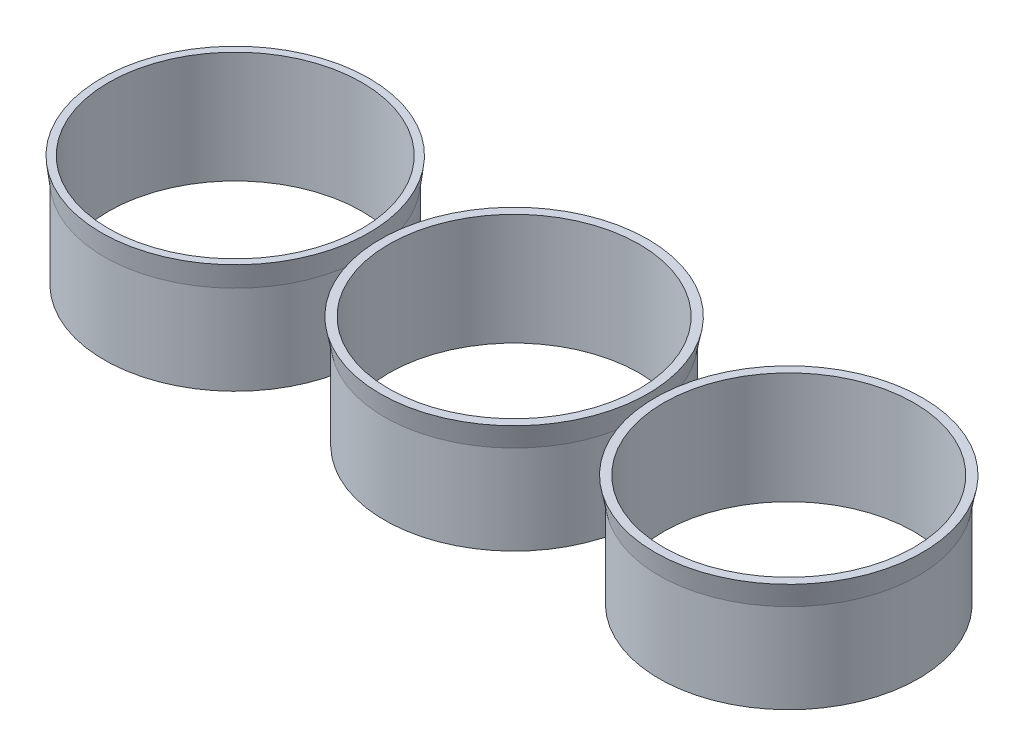
ISO-10303-21;
HEADER;
FILE_DESCRIPTION(('STEP AP214'),'2;1');
FILE_NAME('part.step','',(''),(''),'','','');
FILE_SCHEMA(('AUTOMOTIVE_DESIGN { 1 0 10303 214 1 1 1 1 }'));
ENDSEC;
DATA;
#1=APPLICATION_CONTEXT('core data for automotive mechanical design processes');
#2=APPLICATION_PROTOCOL_DEFINITION('international standard','automotive_design',2000,#1);
#3=PRODUCT_CONTEXT('',#1,'mechanical');
#4=PRODUCT('Part','Part','',(#3));
#5=PRODUCT_RELATED_PRODUCT_CATEGORY('part','',(#4));
#6=PRODUCT_DEFINITION_FORMATION('','',#4);
#7=PRODUCT_DEFINITION_CONTEXT('part definition',#1,'design');
#8=PRODUCT_DEFINITION('design','',#6,#7);
#9=PRODUCT_DEFINITION_SHAPE('','',#8);
#10=(LENGTH_UNIT() NAMED_UNIT(*) SI_UNIT(.MILLI.,.METRE.));
#11=(NAMED_UNIT(*) PLANE_ANGLE_UNIT() SI_UNIT($,.RADIAN.));
#12=(NAMED_UNIT(*) SI_UNIT($,.STERADIAN.) SOLID_ANGLE_UNIT());
#13=UNCERTAINTY_MEASURE_WITH_UNIT(LENGTH_MEASURE(1.E-05),#10,'distance_accuracy_value','');
#14=(GEOMETRIC_REPRESENTATION_CONTEXT(3) GLOBAL_UNCERTAINTY_ASSIGNED_CONTEXT((#13)) GLOBAL_UNIT_ASSIGNED_CONTEXT((#10,
#11,#12)) REPRESENTATION_CONTEXT('',''));
#15=CARTESIAN_POINT('',(0.,0.,0.));
#16=DIRECTION('',(0.,0.,1.));
#17=DIRECTION('',(1.,0.,0.));
#18=AXIS2_PLACEMENT_3D('',#15,#16,#17);
#19=CARTESIAN_POINT('',(121.7,0.,0.));
#20=DIRECTION('',(0.,-1.,0.));
#21=DIRECTION('',(0.,0.,-1.));
#22=AXIS2_PLACEMENT_3D('',#19,#20,#21);
#23=PLANE('',#22);
#24=CARTESIAN_POINT('',(99.25,0.,0.));
#25=DIRECTION('',(0.,-1.,0.));
#26=DIRECTION('',(0.,0.,-1.));
#27=AXIS2_PLACEMENT_3D('',#24,#25,#26);
#28=CIRCLE('',#27,23.25);
#29=CARTESIAN_POINT('',(99.25,0.,-23.25));
#30=VERTEX_POINT('',#29);
#31=EDGE_CURVE('E11',#30,#30,#28,.T.);
#32=ORIENTED_EDGE('',*,*,#31,.T.);
#33=EDGE_LOOP('',(#32));
#34=FACE_BOUND('',#33,.T.);
#35=CARTESIAN_POINT('',(99.25,0.,0.));
#36=DIRECTION('',(0.,-1.,0.));
#37=DIRECTION('',(0.,0.,-1.));
#38=AXIS2_PLACEMENT_3D('',#35,#36,#37);
#39=CIRCLE('',#38,22.45);
#40=CARTESIAN_POINT('',(99.25,0.,-22.45));
#41=VERTEX_POINT('',#40);
#42=EDGE_CURVE('E59',#41,#41,#39,.T.);
#43=ORIENTED_EDGE('',*,*,#42,.F.);
#44=EDGE_LOOP('',(#43));
#45=FACE_BOUND('',#44,.T.);
#46=ADVANCED_FACE('F40',(#34,#45),#23,.T.);
#47=CARTESIAN_POINT('',(99.25,0.,0.));
#48=DIRECTION('',(0.,-1.,0.));
#49=DIRECTION('',(0.,0.,-1.));
#50=AXIS2_PLACEMENT_3D('',#47,#48,#49);
#51=CYLINDRICAL_SURFACE('',#50,23.25);
#52=CARTESIAN_POINT('',(99.25,16.,0.));
#53=DIRECTION('',(0.,-1.,0.));
#54=DIRECTION('',(0.,0.,-1.));
#55=AXIS2_PLACEMENT_3D('',#52,#53,#54);
#56=CIRCLE('',#55,23.25);
#57=CARTESIAN_POINT('',(99.25,16.,-23.25));
#58=VERTEX_POINT('',#57);
#59=EDGE_CURVE('E46',#58,#58,#56,.T.);
#60=ORIENTED_EDGE('',*,*,#59,.T.);
#61=EDGE_LOOP('',(#60));
#62=FACE_BOUND('',#61,.T.);
#63=ORIENTED_EDGE('',*,*,#31,.F.);
#64=EDGE_LOOP('',(#63));
#65=FACE_BOUND('',#64,.T.);
#66=ADVANCED_FACE('F67',(#62,#65),#51,.T.);
#67=CARTESIAN_POINT('',(99.25,16.,0.));
#68=DIRECTION('',(0.,1.,0.));
#69=DIRECTION('',(0.,0.,1.));
#70=AXIS2_PLACEMENT_3D('',#67,#68,#69);
#71=CONICAL_SURFACE('',#70,23.25,0.185347949995695);
#72=CARTESIAN_POINT('',(99.25,20.,0.));
#73=DIRECTION('',(0.,-1.,0.));
#74=DIRECTION('',(0.,0.,-1.));
#75=AXIS2_PLACEMENT_3D('',#72,#73,#74);
#76=CIRCLE('',#75,24.);
#77=CARTESIAN_POINT('',(99.25,20.,-24.));
#78=VERTEX_POINT('',#77);
#79=EDGE_CURVE('E50',#78,#78,#76,.T.);
#80=ORIENTED_EDGE('',*,*,#79,.T.);
#81=EDGE_LOOP('',(#80));
#82=FACE_BOUND('',#81,.T.);
#83=ORIENTED_EDGE('',*,*,#59,.F.);
#84=EDGE_LOOP('',(#83));
#85=FACE_BOUND('',#84,.T.);
#86=ADVANCED_FACE('F71',(#82,#85),#71,.T.);
#87=CARTESIAN_POINT('',(123.25,20.,0.));
#88=DIRECTION('',(0.,1.,0.));
#89=DIRECTION('',(0.,0.,1.));
#90=AXIS2_PLACEMENT_3D('',#87,#88,#89);
#91=PLANE('',#90);
#92=CARTESIAN_POINT('',(99.25,20.,0.));
#93=DIRECTION('',(0.,-1.,0.));
#94=DIRECTION('',(0.,0.,-1.));
#95=AXIS2_PLACEMENT_3D('',#92,#93,#94);
#96=CIRCLE('',#95,22.45);
#97=CARTESIAN_POINT('',(99.25,20.,-22.45));
#98=VERTEX_POINT('',#97);
#99=EDGE_CURVE('E54',#98,#98,#96,.T.);
#100=ORIENTED_EDGE('',*,*,#99,.T.);
#101=EDGE_LOOP('',(#100));
#102=FACE_BOUND('',#101,.T.);
#103=ORIENTED_EDGE('',*,*,#79,.F.);
#104=EDGE_LOOP('',(#103));
#105=FACE_BOUND('',#104,.T.);
#106=ADVANCED_FACE('F75',(#102,#105),#91,.T.);
#107=CARTESIAN_POINT('',(99.25,0.,0.));
#108=DIRECTION('',(0.,-1.,0.));
#109=DIRECTION('',(0.,0.,-1.));
#110=AXIS2_PLACEMENT_3D('',#107,#108,#109);
#111=CYLINDRICAL_SURFACE('',#110,22.45);
#112=ORIENTED_EDGE('',*,*,#42,.T.);
#113=EDGE_LOOP('',(#112));
#114=FACE_BOUND('',#113,.T.);
#115=ORIENTED_EDGE('',*,*,#99,.F.);
#116=EDGE_LOOP('',(#115));
#117=FACE_BOUND('',#116,.T.);
#118=ADVANCED_FACE('F63',(#114,#117),#111,.F.);
#119=CLOSED_SHELL('',(#46,#66,#86,#106,#118));
#120=MANIFOLD_SOLID_BREP('B2',#119);
#121=CARTESIAN_POINT('',(72.45,0.,0.));
#122=DIRECTION('',(0.,-1.,0.));
#123=DIRECTION('',(0.,0.,-1.));
#124=AXIS2_PLACEMENT_3D('',#121,#122,#123);
#125=PLANE('',#124);
#126=CARTESIAN_POINT('',(50.,0.,0.));
#127=DIRECTION('',(0.,-1.,0.));
#128=DIRECTION('',(0.,0.,-1.));
#129=AXIS2_PLACEMENT_3D('',#126,#127,#128);
#130=CIRCLE('',#129,23.25);
#131=CARTESIAN_POINT('',(50.,0.,-23.25));
#132=VERTEX_POINT('',#131);
#133=EDGE_CURVE('E39',#132,#132,#130,.T.);
#134=ORIENTED_EDGE('',*,*,#133,.T.);
#135=EDGE_LOOP('',(#134));
#136=FACE_BOUND('',#135,.T.);
#137=CARTESIAN_POINT('',(50.,0.,0.));
#138=DIRECTION('',(0.,-1.,0.));
#139=DIRECTION('',(0.,0.,-1.));
#140=AXIS2_PLACEMENT_3D('',#137,#138,#139);
#141=CIRCLE('',#140,22.45);
#142=CARTESIAN_POINT('',(50.,0.,-22.45));
#143=VERTEX_POINT('',#142);
#144=EDGE_CURVE('E143',#143,#143,#141,.T.);
#145=ORIENTED_EDGE('',*,*,#144,.F.);
#146=EDGE_LOOP('',(#145));
#147=FACE_BOUND('',#146,.T.);
#148=ADVANCED_FACE('F124',(#136,#147),#125,.T.);
#149=CARTESIAN_POINT('',(50.,0.,0.));
#150=DIRECTION('',(0.,-1.,0.));
#151=DIRECTION('',(0.,0.,-1.));
#152=AXIS2_PLACEMENT_3D('',#149,#150,#151);
#153=CYLINDRICAL_SURFACE('',#152,23.25);
#154=CARTESIAN_POINT('',(50.,16.,0.));
#155=DIRECTION('',(0.,-1.,0.));
#156=DIRECTION('',(0.,0.,-1.));
#157=AXIS2_PLACEMENT_3D('',#154,#155,#156);
#158=CIRCLE('',#157,23.25);
#159=CARTESIAN_POINT('',(50.,16.,-23.25));
#160=VERTEX_POINT('',#159);
#161=EDGE_CURVE('E130',#160,#160,#158,.T.);
#162=ORIENTED_EDGE('',*,*,#161,.T.);
#163=EDGE_LOOP('',(#162));
#164=FACE_BOUND('',#163,.T.);
#165=ORIENTED_EDGE('',*,*,#133,.F.);
#166=EDGE_LOOP('',(#165));
#167=FACE_BOUND('',#166,.T.);
#168=ADVANCED_FACE('F151',(#164,#167),#153,.T.);
#169=CARTESIAN_POINT('',(50.,16.,0.));
#170=DIRECTION('',(0.,1.,0.));
#171=DIRECTION('',(0.,0.,1.));
#172=AXIS2_PLACEMENT_3D('',#169,#170,#171);
#173=CONICAL_SURFACE('',#172,23.25,0.185347949995695);
#174=CARTESIAN_POINT('',(50.,20.,0.));
#175=DIRECTION('',(0.,-1.,0.));
#176=DIRECTION('',(0.,0.,-1.));
#177=AXIS2_PLACEMENT_3D('',#174,#175,#176);
#178=CIRCLE('',#177,24.);
#179=CARTESIAN_POINT('',(50.,20.,-24.));
#180=VERTEX_POINT('',#179);
#181=EDGE_CURVE('E134',#180,#180,#178,.T.);
#182=ORIENTED_EDGE('',*,*,#181,.T.);
#183=EDGE_LOOP('',(#182));
#184=FACE_BOUND('',#183,.T.);
#185=ORIENTED_EDGE('',*,*,#161,.F.);
#186=EDGE_LOOP('',(#185));
#187=FACE_BOUND('',#186,.T.);
#188=ADVANCED_FACE('F155',(#184,#187),#173,.T.);
#189=CARTESIAN_POINT('',(74.,20.,0.));
#190=DIRECTION('',(0.,1.,0.));
#191=DIRECTION('',(0.,0.,1.));
#192=AXIS2_PLACEMENT_3D('',#189,#190,#191);
#193=PLANE('',#192);
#194=CARTESIAN_POINT('',(50.,20.,0.));
#195=DIRECTION('',(0.,-1.,0.));
#196=DIRECTION('',(0.,0.,-1.));
#197=AXIS2_PLACEMENT_3D('',#194,#195,#196);
#198=CIRCLE('',#197,22.45);
#199=CARTESIAN_POINT('',(50.,20.,-22.45));
#200=VERTEX_POINT('',#199);
#201=EDGE_CURVE('E138',#200,#200,#198,.T.);
#202=ORIENTED_EDGE('',*,*,#201,.T.);
#203=EDGE_LOOP('',(#202));
#204=FACE_BOUND('',#203,.T.);
#205=ORIENTED_EDGE('',*,*,#181,.F.);
#206=EDGE_LOOP('',(#205));
#207=FACE_BOUND('',#206,.T.);
#208=ADVANCED_FACE('F159',(#204,#207),#193,.T.);
#209=CARTESIAN_POINT('',(50.,0.,0.));
#210=DIRECTION('',(0.,-1.,0.));
#211=DIRECTION('',(0.,0.,-1.));
#212=AXIS2_PLACEMENT_3D('',#209,#210,#211);
#213=CYLINDRICAL_SURFACE('',#212,22.45);
#214=ORIENTED_EDGE('',*,*,#144,.T.);
#215=EDGE_LOOP('',(#214));
#216=FACE_BOUND('',#215,.T.);
#217=ORIENTED_EDGE('',*,*,#201,.F.);
#218=EDGE_LOOP('',(#217));
#219=FACE_BOUND('',#218,.T.);
#220=ADVANCED_FACE('F147',(#216,#219),#213,.F.);
#221=CLOSED_SHELL('',(#148,#168,#188,#208,#220));
#222=MANIFOLD_SOLID_BREP('B6',#221);
#223=CARTESIAN_POINT('',(23.5,0.,0.));
#224=DIRECTION('',(0.,-1.,0.));
#225=DIRECTION('',(0.,0.,-1.));
#226=AXIS2_PLACEMENT_3D('',#223,#224,#225);
#227=PLANE('',#226);
#228=CARTESIAN_POINT('',(0.,0.,0.));
#229=DIRECTION('',(0.,-1.,0.));
#230=DIRECTION('',(0.,0.,-1.));
#231=AXIS2_PLACEMENT_3D('',#228,#229,#230);
#232=CIRCLE('',#231,23.5);
#233=CARTESIAN_POINT('',(0.,0.,-23.5));
#234=VERTEX_POINT('',#233);
#235=EDGE_CURVE('E220',#234,#234,#232,.T.);
#236=ORIENTED_EDGE('',*,*,#235,.T.);
#237=EDGE_LOOP('',(#236));
#238=FACE_BOUND('',#237,.T.);
#239=CARTESIAN_POINT('',(0.,0.,0.));
#240=DIRECTION('',(0.,-1.,0.));
#241=DIRECTION('',(0.,0.,-1.));
#242=AXIS2_PLACEMENT_3D('',#239,#240,#241);
#243=CIRCLE('',#242,22.7);
#244=CARTESIAN_POINT('',(0.,0.,-22.7));
#245=VERTEX_POINT('',#244);
#246=EDGE_CURVE('E123',#245,#245,#243,.T.);
#247=ORIENTED_EDGE('',*,*,#246,.F.);
#248=EDGE_LOOP('',(#247));
#249=FACE_BOUND('',#248,.T.);
#250=ADVANCED_FACE('F201',(#238,#249),#227,.T.);
#251=CARTESIAN_POINT('',(0.,0.,0.));
#252=DIRECTION('',(0.,-1.,0.));
#253=DIRECTION('',(0.,0.,-1.));
#254=AXIS2_PLACEMENT_3D('',#251,#252,#253);
#255=CYLINDRICAL_SURFACE('',#254,22.7);
#256=ORIENTED_EDGE('',*,*,#246,.T.);
#257=EDGE_LOOP('',(#256));
#258=FACE_BOUND('',#257,.T.);
#259=CARTESIAN_POINT('',(0.,20.,0.));
#260=DIRECTION('',(0.,-1.,0.));
#261=DIRECTION('',(0.,0.,-1.));
#262=AXIS2_PLACEMENT_3D('',#259,#260,#261);
#263=CIRCLE('',#262,22.7);
#264=CARTESIAN_POINT('',(0.,20.,-22.7));
#265=VERTEX_POINT('',#264);
#266=EDGE_CURVE('E207',#265,#265,#263,.T.);
#267=ORIENTED_EDGE('',*,*,#266,.F.);
#268=EDGE_LOOP('',(#267));
#269=FACE_BOUND('',#268,.T.);
#270=ADVANCED_FACE('F238',(#258,#269),#255,.F.);
#271=CARTESIAN_POINT('',(22.7,20.,0.));
#272=DIRECTION('',(0.,1.,0.));
#273=DIRECTION('',(0.,0.,1.));
#274=AXIS2_PLACEMENT_3D('',#271,#272,#273);
#275=PLANE('',#274);
#276=ORIENTED_EDGE('',*,*,#266,.T.);
#277=EDGE_LOOP('',(#276));
#278=FACE_BOUND('',#277,.T.);
#279=CARTESIAN_POINT('',(0.,20.,0.));
#280=DIRECTION('',(0.,-1.,0.));
#281=DIRECTION('',(0.,0.,-1.));
#282=AXIS2_PLACEMENT_3D('',#279,#280,#281);
#283=CIRCLE('',#282,24.);
#284=CARTESIAN_POINT('',(0.,20.,-24.));
#285=VERTEX_POINT('',#284);
#286=EDGE_CURVE('E211',#285,#285,#283,.T.);
#287=ORIENTED_EDGE('',*,*,#286,.F.);
#288=EDGE_LOOP('',(#287));
#289=FACE_BOUND('',#288,.T.);
#290=ADVANCED_FACE('F234',(#278,#289),#275,.T.);
#291=CARTESIAN_POINT('',(0.,16.,0.));
#292=DIRECTION('',(0.,1.,0.));
#293=DIRECTION('',(0.,0.,1.));
#294=AXIS2_PLACEMENT_3D('',#291,#292,#293);
#295=CONICAL_SURFACE('',#294,23.5,0.124354994546762);
#296=ORIENTED_EDGE('',*,*,#286,.T.);
#297=EDGE_LOOP('',(#296));
#298=FACE_BOUND('',#297,.T.);
#299=CARTESIAN_POINT('',(0.,16.,0.));
#300=DIRECTION('',(0.,-1.,0.));
#301=DIRECTION('',(0.,0.,-1.));
#302=AXIS2_PLACEMENT_3D('',#299,#300,#301);
#303=CIRCLE('',#302,23.5);
#304=CARTESIAN_POINT('',(0.,16.,-23.5));
#305=VERTEX_POINT('',#304);
#306=EDGE_CURVE('E215',#305,#305,#303,.T.);
#307=ORIENTED_EDGE('',*,*,#306,.F.);
#308=EDGE_LOOP('',(#307));
#309=FACE_BOUND('',#308,.T.);
#310=ADVANCED_FACE('F228',(#298,#309),#295,.T.);
#311=CARTESIAN_POINT('',(0.,0.,0.));
#312=DIRECTION('',(0.,-1.,0.));
#313=DIRECTION('',(0.,0.,-1.));
#314=AXIS2_PLACEMENT_3D('',#311,#312,#313);
#315=CYLINDRICAL_SURFACE('',#314,23.5);
#316=ORIENTED_EDGE('',*,*,#306,.T.);
#317=EDGE_LOOP('',(#316));
#318=FACE_BOUND('',#317,.T.);
#319=ORIENTED_EDGE('',*,*,#235,.F.);
#320=EDGE_LOOP('',(#319));
#321=FACE_BOUND('',#320,.T.);
#322=ADVANCED_FACE('F226',(#318,#321),#315,.T.);
#323=CLOSED_SHELL('',(#250,#270,#290,#310,#322));
#324=MANIFOLD_SOLID_BREP('B34',#323);
#325=ADVANCED_BREP_SHAPE_REPRESENTATION('',(#18,#120,#222,#324),#14);
#326=SHAPE_DEFINITION_REPRESENTATION(#9,#325);
ENDSEC;
END-ISO-10303-21;
